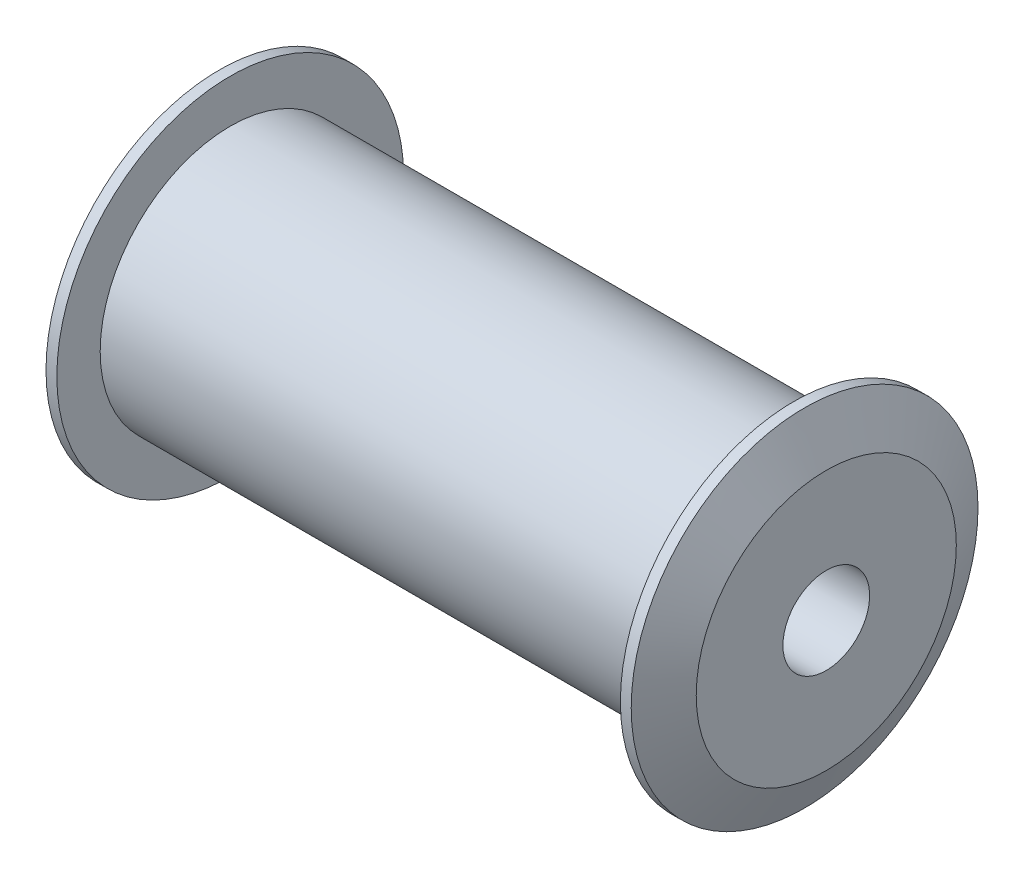
ISO-10303-21;
HEADER;
FILE_DESCRIPTION(('STEP AP214'),'2;1');
FILE_NAME('part.step','',(''),(''),'','','');
FILE_SCHEMA(('AUTOMOTIVE_DESIGN { 1 0 10303 214 1 1 1 1 }'));
ENDSEC;
DATA;
#1=APPLICATION_CONTEXT('core data for automotive mechanical design processes');
#2=APPLICATION_PROTOCOL_DEFINITION('international standard','automotive_design',2000,#1);
#3=PRODUCT_CONTEXT('',#1,'mechanical');
#4=PRODUCT('Part','Part','',(#3));
#5=PRODUCT_RELATED_PRODUCT_CATEGORY('part','',(#4));
#6=PRODUCT_DEFINITION_FORMATION('','',#4);
#7=PRODUCT_DEFINITION_CONTEXT('part definition',#1,'design');
#8=PRODUCT_DEFINITION('design','',#6,#7);
#9=PRODUCT_DEFINITION_SHAPE('','',#8);
#10=(LENGTH_UNIT() NAMED_UNIT(*) SI_UNIT(.MILLI.,.METRE.));
#11=(NAMED_UNIT(*) PLANE_ANGLE_UNIT() SI_UNIT($,.RADIAN.));
#12=(NAMED_UNIT(*) SI_UNIT($,.STERADIAN.) SOLID_ANGLE_UNIT());
#13=UNCERTAINTY_MEASURE_WITH_UNIT(LENGTH_MEASURE(1.E-05),#10,'distance_accuracy_value','');
#14=(GEOMETRIC_REPRESENTATION_CONTEXT(3) GLOBAL_UNCERTAINTY_ASSIGNED_CONTEXT((#13)) GLOBAL_UNIT_ASSIGNED_CONTEXT((#10,
#11,#12)) REPRESENTATION_CONTEXT('',''));
#15=CARTESIAN_POINT('',(0.,0.,0.));
#16=DIRECTION('',(0.,0.,1.));
#17=DIRECTION('',(1.,0.,0.));
#18=AXIS2_PLACEMENT_3D('',#15,#16,#17);
#19=CARTESIAN_POINT('',(-13.,55.,0.));
#20=DIRECTION('',(-1.,0.,0.));
#21=DIRECTION('',(0.,0.,1.));
#22=AXIS2_PLACEMENT_3D('',#19,#20,#21);
#23=PLANE('',#22);
#24=CARTESIAN_POINT('',(-13.,47.,0.));
#25=DIRECTION('',(-1.,0.,0.));
#26=DIRECTION('',(0.,0.,1.));
#27=AXIS2_PLACEMENT_3D('',#24,#25,#26);
#28=CIRCLE('',#27,8.);
#29=CARTESIAN_POINT('',(-13.,47.,8.));
#30=VERTEX_POINT('',#29);
#31=EDGE_CURVE('E47',#30,#30,#28,.T.);
#32=ORIENTED_EDGE('',*,*,#31,.F.);
#33=EDGE_LOOP('',(#32));
#34=FACE_BOUND('',#33,.T.);
#35=CARTESIAN_POINT('',(-13.,47.,0.));
#36=DIRECTION('',(-1.,0.,0.));
#37=DIRECTION('',(0.,0.,1.));
#38=AXIS2_PLACEMENT_3D('',#35,#36,#37);
#39=CIRCLE('',#38,6.);
#40=CARTESIAN_POINT('',(-13.,47.,6.));
#41=VERTEX_POINT('',#40);
#42=EDGE_CURVE('E62',#41,#41,#39,.T.);
#43=ORIENTED_EDGE('',*,*,#42,.T.);
#44=EDGE_LOOP('',(#43));
#45=FACE_BOUND('',#44,.T.);
#46=ADVANCED_FACE('F28',(#34,#45),#23,.F.);
#47=CARTESIAN_POINT('',(-54.7332380427494,47.,0.));
#48=DIRECTION('',(-1.,0.,0.));
#49=DIRECTION('',(0.,0.,1.));
#50=AXIS2_PLACEMENT_3D('',#47,#48,#49);
#51=CYLINDRICAL_SURFACE('',#50,8.);
#52=CARTESIAN_POINT('',(-13.5,47.,0.));
#53=DIRECTION('',(1.,0.,0.));
#54=DIRECTION('',(0.,0.,-1.));
#55=AXIS2_PLACEMENT_3D('',#52,#53,#54);
#56=CIRCLE('',#55,8.);
#57=CARTESIAN_POINT('',(-13.5,47.,-8.));
#58=VERTEX_POINT('',#57);
#59=EDGE_CURVE('E38',#58,#58,#56,.T.);
#60=ORIENTED_EDGE('',*,*,#59,.T.);
#61=EDGE_LOOP('',(#60));
#62=FACE_BOUND('',#61,.T.);
#63=ORIENTED_EDGE('',*,*,#31,.T.);
#64=EDGE_LOOP('',(#63));
#65=FACE_BOUND('',#64,.T.);
#66=ADVANCED_FACE('F90',(#62,#65),#51,.T.);
#67=CARTESIAN_POINT('',(-14.5,55.,0.));
#68=DIRECTION('',(1.,0.,0.));
#69=DIRECTION('',(0.,0.,-1.));
#70=AXIS2_PLACEMENT_3D('',#67,#68,#69);
#71=PLANE('',#70);
#72=CARTESIAN_POINT('',(-14.5,47.,0.));
#73=DIRECTION('',(1.,0.,0.));
#74=DIRECTION('',(0.,0.,-1.));
#75=AXIS2_PLACEMENT_3D('',#72,#73,#74);
#76=CIRCLE('',#75,5.99999999999996);
#77=CARTESIAN_POINT('',(-14.5,47.,-5.99999999999996));
#78=VERTEX_POINT('',#77);
#79=EDGE_CURVE('E42',#78,#78,#76,.F.);
#80=ORIENTED_EDGE('',*,*,#79,.T.);
#81=EDGE_LOOP('',(#80));
#82=FACE_BOUND('',#81,.T.);
#83=CARTESIAN_POINT('',(-14.5,47.,0.));
#84=DIRECTION('',(-1.,0.,0.));
#85=DIRECTION('',(0.,0.,1.));
#86=AXIS2_PLACEMENT_3D('',#83,#84,#85);
#87=CIRCLE('',#86,2.);
#88=CARTESIAN_POINT('',(-14.5,47.,2.));
#89=VERTEX_POINT('',#88);
#90=EDGE_CURVE('E50',#89,#89,#87,.T.);
#91=ORIENTED_EDGE('',*,*,#90,.F.);
#92=EDGE_LOOP('',(#91));
#93=FACE_BOUND('',#92,.T.);
#94=ADVANCED_FACE('F95',(#82,#93),#71,.F.);
#95=CARTESIAN_POINT('',(-54.7332380427494,47.,0.));
#96=DIRECTION('',(-1.,0.,0.));
#97=DIRECTION('',(0.,0.,1.));
#98=AXIS2_PLACEMENT_3D('',#95,#96,#97);
#99=CYLINDRICAL_SURFACE('',#98,2.);
#100=CARTESIAN_POINT('',(14.5,47.,0.));
#101=DIRECTION('',(-1.,0.,0.));
#102=DIRECTION('',(0.,0.,1.));
#103=AXIS2_PLACEMENT_3D('',#100,#101,#102);
#104=CIRCLE('',#103,2.);
#105=CARTESIAN_POINT('',(14.5,47.,2.));
#106=VERTEX_POINT('',#105);
#107=EDGE_CURVE('E53',#106,#106,#104,.T.);
#108=ORIENTED_EDGE('',*,*,#107,.F.);
#109=EDGE_LOOP('',(#108));
#110=FACE_BOUND('',#109,.T.);
#111=ORIENTED_EDGE('',*,*,#90,.T.);
#112=EDGE_LOOP('',(#111));
#113=FACE_BOUND('',#112,.T.);
#114=ADVANCED_FACE('F87',(#110,#113),#99,.F.);
#115=CARTESIAN_POINT('',(14.5,55.,0.));
#116=DIRECTION('',(-1.,0.,0.));
#117=DIRECTION('',(0.,0.,1.));
#118=AXIS2_PLACEMENT_3D('',#115,#116,#117);
#119=PLANE('',#118);
#120=CARTESIAN_POINT('',(14.5,47.,0.));
#121=DIRECTION('',(-1.,0.,0.));
#122=DIRECTION('',(0.,0.,1.));
#123=AXIS2_PLACEMENT_3D('',#120,#121,#122);
#124=CIRCLE('',#123,6.00000000000001);
#125=CARTESIAN_POINT('',(14.5,47.,6.00000000000001));
#126=VERTEX_POINT('',#125);
#127=EDGE_CURVE('E10',#126,#126,#124,.F.);
#128=ORIENTED_EDGE('',*,*,#127,.T.);
#129=EDGE_LOOP('',(#128));
#130=FACE_BOUND('',#129,.T.);
#131=ORIENTED_EDGE('',*,*,#107,.T.);
#132=EDGE_LOOP('',(#131));
#133=FACE_BOUND('',#132,.T.);
#134=ADVANCED_FACE('F82',(#130,#133),#119,.F.);
#135=CARTESIAN_POINT('',(-54.7332380427494,47.,0.));
#136=DIRECTION('',(-1.,0.,0.));
#137=DIRECTION('',(0.,0.,1.));
#138=AXIS2_PLACEMENT_3D('',#135,#136,#137);
#139=CYLINDRICAL_SURFACE('',#138,8.00000000000001);
#140=CARTESIAN_POINT('',(13.5,47.,0.));
#141=DIRECTION('',(-1.,0.,0.));
#142=DIRECTION('',(0.,0.,1.));
#143=AXIS2_PLACEMENT_3D('',#140,#141,#142);
#144=CIRCLE('',#143,8.00000000000001);
#145=CARTESIAN_POINT('',(13.5,47.,8.00000000000001));
#146=VERTEX_POINT('',#145);
#147=EDGE_CURVE('E34',#146,#146,#144,.T.);
#148=ORIENTED_EDGE('',*,*,#147,.T.);
#149=EDGE_LOOP('',(#148));
#150=FACE_BOUND('',#149,.T.);
#151=CARTESIAN_POINT('',(13.,47.,0.));
#152=DIRECTION('',(-1.,0.,0.));
#153=DIRECTION('',(0.,0.,1.));
#154=AXIS2_PLACEMENT_3D('',#151,#152,#153);
#155=CIRCLE('',#154,8.00000000000001);
#156=CARTESIAN_POINT('',(13.,47.,8.00000000000001));
#157=VERTEX_POINT('',#156);
#158=EDGE_CURVE('E56',#157,#157,#155,.T.);
#159=ORIENTED_EDGE('',*,*,#158,.F.);
#160=EDGE_LOOP('',(#159));
#161=FACE_BOUND('',#160,.T.);
#162=ADVANCED_FACE('F77',(#150,#161),#139,.T.);
#163=CARTESIAN_POINT('',(13.,55.,0.));
#164=DIRECTION('',(1.,0.,0.));
#165=DIRECTION('',(0.,0.,-1.));
#166=AXIS2_PLACEMENT_3D('',#163,#164,#165);
#167=PLANE('',#166);
#168=CARTESIAN_POINT('',(13.,47.,0.));
#169=DIRECTION('',(-1.,0.,0.));
#170=DIRECTION('',(0.,0.,1.));
#171=AXIS2_PLACEMENT_3D('',#168,#169,#170);
#172=CIRCLE('',#171,6.);
#173=CARTESIAN_POINT('',(13.,47.,6.));
#174=VERTEX_POINT('',#173);
#175=EDGE_CURVE('E59',#174,#174,#172,.T.);
#176=ORIENTED_EDGE('',*,*,#175,.F.);
#177=EDGE_LOOP('',(#176));
#178=FACE_BOUND('',#177,.T.);
#179=ORIENTED_EDGE('',*,*,#158,.T.);
#180=EDGE_LOOP('',(#179));
#181=FACE_BOUND('',#180,.T.);
#182=ADVANCED_FACE('F71',(#178,#181),#167,.F.);
#183=CARTESIAN_POINT('',(-54.7332380427494,47.,0.));
#184=DIRECTION('',(-1.,0.,0.));
#185=DIRECTION('',(0.,0.,1.));
#186=AXIS2_PLACEMENT_3D('',#183,#184,#185);
#187=CYLINDRICAL_SURFACE('',#186,6.);
#188=ORIENTED_EDGE('',*,*,#42,.F.);
#189=EDGE_LOOP('',(#188));
#190=FACE_BOUND('',#189,.T.);
#191=ORIENTED_EDGE('',*,*,#175,.T.);
#192=EDGE_LOOP('',(#191));
#193=FACE_BOUND('',#192,.T.);
#194=ADVANCED_FACE('F67',(#190,#193),#187,.T.);
#195=CARTESIAN_POINT('',(-14.5,47.,0.));
#196=DIRECTION('',(1.,0.,0.));
#197=DIRECTION('',(0.,0.,-1.));
#198=AXIS2_PLACEMENT_3D('',#195,#196,#197);
#199=CONICAL_SURFACE('',#198,5.99999999999997,1.10714871779409);
#200=ORIENTED_EDGE('',*,*,#59,.F.);
#201=EDGE_LOOP('',(#200));
#202=FACE_BOUND('',#201,.T.);
#203=ORIENTED_EDGE('',*,*,#79,.F.);
#204=EDGE_LOOP('',(#203));
#205=FACE_BOUND('',#204,.T.);
#206=ADVANCED_FACE('F70',(#202,#205),#199,.T.);
#207=CARTESIAN_POINT('',(13.5,47.,0.));
#208=DIRECTION('',(-1.,0.,0.));
#209=DIRECTION('',(0.,0.,1.));
#210=AXIS2_PLACEMENT_3D('',#207,#208,#209);
#211=CONICAL_SURFACE('',#210,8.00000000000001,1.10714871779409);
#212=ORIENTED_EDGE('',*,*,#127,.F.);
#213=EDGE_LOOP('',(#212));
#214=FACE_BOUND('',#213,.T.);
#215=ORIENTED_EDGE('',*,*,#147,.F.);
#216=EDGE_LOOP('',(#215));
#217=FACE_BOUND('',#216,.T.);
#218=ADVANCED_FACE('F135',(#214,#217),#211,.T.);
#219=CLOSED_SHELL('',(#46,#66,#94,#114,#134,#162,#182,#194,#206,#218));
#220=MANIFOLD_SOLID_BREP('B2',#219);
#221=ADVANCED_BREP_SHAPE_REPRESENTATION('',(#18,#220),#14);
#222=SHAPE_DEFINITION_REPRESENTATION(#9,#221);
ENDSEC;
END-ISO-10303-21;
